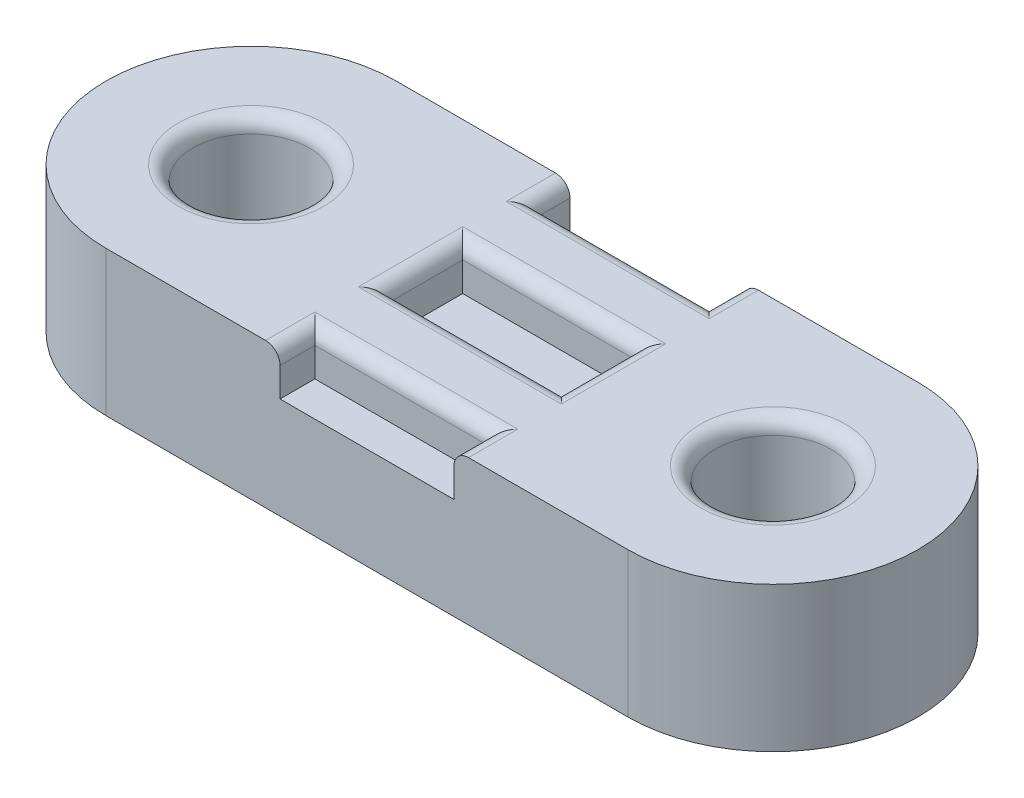
ISO-10303-21;
HEADER;
FILE_DESCRIPTION(('STEP AP214'),'2;1');
FILE_NAME('part.step','',(''),(''),'','','');
FILE_SCHEMA(('AUTOMOTIVE_DESIGN { 1 0 10303 214 1 1 1 1 }'));
ENDSEC;
DATA;
#1=APPLICATION_CONTEXT('core data for automotive mechanical design processes');
#2=APPLICATION_PROTOCOL_DEFINITION('international standard','automotive_design',2000,#1);
#3=PRODUCT_CONTEXT('',#1,'mechanical');
#4=PRODUCT('Part','Part','',(#3));
#5=PRODUCT_RELATED_PRODUCT_CATEGORY('part','',(#4));
#6=PRODUCT_DEFINITION_FORMATION('','',#4);
#7=PRODUCT_DEFINITION_CONTEXT('part definition',#1,'design');
#8=PRODUCT_DEFINITION('design','',#6,#7);
#9=PRODUCT_DEFINITION_SHAPE('','',#8);
#10=(LENGTH_UNIT() NAMED_UNIT(*) SI_UNIT(.MILLI.,.METRE.));
#11=(NAMED_UNIT(*) PLANE_ANGLE_UNIT() SI_UNIT($,.RADIAN.));
#12=(NAMED_UNIT(*) SI_UNIT($,.STERADIAN.) SOLID_ANGLE_UNIT());
#13=UNCERTAINTY_MEASURE_WITH_UNIT(LENGTH_MEASURE(1.E-05),#10,'distance_accuracy_value','');
#14=(GEOMETRIC_REPRESENTATION_CONTEXT(3) GLOBAL_UNCERTAINTY_ASSIGNED_CONTEXT((#13)) GLOBAL_UNIT_ASSIGNED_CONTEXT((#10,
#11,#12)) REPRESENTATION_CONTEXT('',''));
#15=CARTESIAN_POINT('',(0.,0.,0.));
#16=DIRECTION('',(0.,0.,1.));
#17=DIRECTION('',(1.,0.,0.));
#18=AXIS2_PLACEMENT_3D('',#15,#16,#17);
#19=CARTESIAN_POINT('',(-18.,5.,-5.));
#20=DIRECTION('',(0.,-1.,0.));
#21=DIRECTION('',(0.,0.,-1.));
#22=AXIS2_PLACEMENT_3D('',#19,#20,#21);
#23=CYLINDRICAL_SURFACE('',#22,5.);
#24=CARTESIAN_POINT('',(-18.,0.,-5.));
#25=DIRECTION('',(0.,1.,0.));
#26=DIRECTION('',(0.,0.,1.));
#27=AXIS2_PLACEMENT_3D('',#24,#25,#26);
#28=CIRCLE('',#27,5.);
#29=CARTESIAN_POINT('',(-18.,0.,-10.));
#30=VERTEX_POINT('',#29);
#31=CARTESIAN_POINT('',(-18.,0.,0.));
#32=VERTEX_POINT('',#31);
#33=EDGE_CURVE('E258',#30,#32,#28,.T.);
#34=ORIENTED_EDGE('',*,*,#33,.T.);
#35=DIRECTION('',(0.,-1.,0.));
#36=VECTOR('',#35,1.);
#37=CARTESIAN_POINT('',(-18.,5.,0.));
#38=LINE('',#37,#36);
#39=CARTESIAN_POINT('',(-18.,5.,0.));
#40=VERTEX_POINT('',#39);
#41=EDGE_CURVE('E297',#40,#32,#38,.T.);
#42=ORIENTED_EDGE('',*,*,#41,.F.);
#43=CARTESIAN_POINT('',(-18.,5.,-5.));
#44=DIRECTION('',(0.,1.,0.));
#45=DIRECTION('',(0.,0.,1.));
#46=AXIS2_PLACEMENT_3D('',#43,#44,#45);
#47=CIRCLE('',#46,5.);
#48=CARTESIAN_POINT('',(-18.,5.,-10.));
#49=VERTEX_POINT('',#48);
#50=EDGE_CURVE('E267',#49,#40,#47,.T.);
#51=ORIENTED_EDGE('',*,*,#50,.F.);
#52=DIRECTION('',(0.,-1.,0.));
#53=VECTOR('',#52,1.);
#54=CARTESIAN_POINT('',(-18.,5.,-10.));
#55=LINE('',#54,#53);
#56=EDGE_CURVE('E281',#49,#30,#55,.T.);
#57=ORIENTED_EDGE('',*,*,#56,.T.);
#58=EDGE_LOOP('',(#34,#42,#51,#57));
#59=FACE_BOUND('',#58,.T.);
#60=ADVANCED_FACE('F33',(#59),#23,.T.);
#61=CARTESIAN_POINT('',(-18.,5.,0.));
#62=DIRECTION('',(0.,0.,-1.));
#63=DIRECTION('',(-1.,0.,0.));
#64=AXIS2_PLACEMENT_3D('',#61,#62,#63);
#65=PLANE('',#64);
#66=DIRECTION('',(1.,0.,0.));
#67=VECTOR('',#66,1.);
#68=CARTESIAN_POINT('',(-18.,5.,0.));
#69=LINE('',#68,#67);
#70=CARTESIAN_POINT('',(-5.49999999999999,5.,0.));
#71=VERTEX_POINT('',#70);
#72=CARTESIAN_POINT('',(0.,5.,0.));
#73=VERTEX_POINT('',#72);
#74=EDGE_CURVE('E270',#71,#73,#69,.T.);
#75=ORIENTED_EDGE('',*,*,#74,.F.);
#76=CARTESIAN_POINT('',(-5.49999999999999,4.5,0.));
#77=DIRECTION('',(0.,0.,-1.));
#78=DIRECTION('',(-1.,0.,0.));
#79=AXIS2_PLACEMENT_3D('',#76,#77,#78);
#80=CIRCLE('',#79,0.5);
#81=CARTESIAN_POINT('',(-5.99999999999999,4.5,0.));
#82=VERTEX_POINT('',#81);
#83=EDGE_CURVE('E350',#71,#82,#80,.F.);
#84=ORIENTED_EDGE('',*,*,#83,.T.);
#85=DIRECTION('',(0.,1.,0.));
#86=VECTOR('',#85,1.);
#87=CARTESIAN_POINT('',(-5.99999999999999,3.5,0.));
#88=LINE('',#87,#86);
#89=CARTESIAN_POINT('',(-5.99999999999999,3.5,0.));
#90=VERTEX_POINT('',#89);
#91=EDGE_CURVE('E262',#90,#82,#88,.T.);
#92=ORIENTED_EDGE('',*,*,#91,.F.);
#93=DIRECTION('',(1.,0.,0.));
#94=VECTOR('',#93,1.);
#95=CARTESIAN_POINT('',(-5.99999999999999,3.5,0.));
#96=LINE('',#95,#94);
#97=CARTESIAN_POINT('',(-12.,3.5,0.));
#98=VERTEX_POINT('',#97);
#99=EDGE_CURVE('E245',#98,#90,#96,.T.);
#100=ORIENTED_EDGE('',*,*,#99,.F.);
#101=DIRECTION('',(0.,1.,0.));
#102=VECTOR('',#101,1.);
#103=CARTESIAN_POINT('',(-12.,3.5,0.));
#104=LINE('',#103,#102);
#105=CARTESIAN_POINT('',(-12.,4.5,0.));
#106=VERTEX_POINT('',#105);
#107=EDGE_CURVE('E254',#98,#106,#104,.T.);
#108=ORIENTED_EDGE('',*,*,#107,.T.);
#109=CARTESIAN_POINT('',(-12.5,4.5,0.));
#110=DIRECTION('',(0.,0.,-1.));
#111=DIRECTION('',(-1.,0.,0.));
#112=AXIS2_PLACEMENT_3D('',#109,#110,#111);
#113=CIRCLE('',#112,0.5);
#114=CARTESIAN_POINT('',(-12.5,5.,0.));
#115=VERTEX_POINT('',#114);
#116=EDGE_CURVE('E348',#106,#115,#113,.F.);
#117=ORIENTED_EDGE('',*,*,#116,.T.);
#118=EDGE_CURVE('E272',#40,#115,#69,.T.);
#119=ORIENTED_EDGE('',*,*,#118,.F.);
#120=ORIENTED_EDGE('',*,*,#41,.T.);
#121=DIRECTION('',(1.,0.,0.));
#122=VECTOR('',#121,1.);
#123=CARTESIAN_POINT('',(-18.,0.,0.));
#124=LINE('',#123,#122);
#125=CARTESIAN_POINT('',(0.,0.,0.));
#126=VERTEX_POINT('',#125);
#127=EDGE_CURVE('E284',#32,#126,#124,.T.);
#128=ORIENTED_EDGE('',*,*,#127,.T.);
#129=DIRECTION('',(0.,-1.,0.));
#130=VECTOR('',#129,1.);
#131=CARTESIAN_POINT('',(0.,5.,0.));
#132=LINE('',#131,#130);
#133=EDGE_CURVE('E294',#73,#126,#132,.T.);
#134=ORIENTED_EDGE('',*,*,#133,.F.);
#135=EDGE_LOOP('',(#75,#84,#92,#100,#108,#117,#119,#120,#128,#134));
#136=FACE_BOUND('',#135,.T.);
#137=ADVANCED_FACE('F439',(#136),#65,.F.);
#138=CARTESIAN_POINT('',(0.,5.,-5.));
#139=DIRECTION('',(0.,-1.,0.));
#140=DIRECTION('',(0.,0.,-1.));
#141=AXIS2_PLACEMENT_3D('',#138,#139,#140);
#142=CYLINDRICAL_SURFACE('',#141,5.);
#143=CARTESIAN_POINT('',(0.,0.,-5.));
#144=DIRECTION('',(0.,1.,0.));
#145=DIRECTION('',(0.,0.,1.));
#146=AXIS2_PLACEMENT_3D('',#143,#144,#145);
#147=CIRCLE('',#146,5.);
#148=CARTESIAN_POINT('',(0.,0.,-10.));
#149=VERTEX_POINT('',#148);
#150=EDGE_CURVE('E286',#126,#149,#147,.T.);
#151=ORIENTED_EDGE('',*,*,#150,.T.);
#152=DIRECTION('',(0.,-1.,0.));
#153=VECTOR('',#152,1.);
#154=CARTESIAN_POINT('',(0.,5.,-10.));
#155=LINE('',#154,#153);
#156=CARTESIAN_POINT('',(0.,5.,-10.));
#157=VERTEX_POINT('',#156);
#158=EDGE_CURVE('E291',#157,#149,#155,.T.);
#159=ORIENTED_EDGE('',*,*,#158,.F.);
#160=CARTESIAN_POINT('',(0.,5.,-5.));
#161=DIRECTION('',(0.,1.,0.));
#162=DIRECTION('',(0.,0.,1.));
#163=AXIS2_PLACEMENT_3D('',#160,#161,#162);
#164=CIRCLE('',#163,5.);
#165=EDGE_CURVE('E275',#73,#157,#164,.T.);
#166=ORIENTED_EDGE('',*,*,#165,.F.);
#167=ORIENTED_EDGE('',*,*,#133,.T.);
#168=EDGE_LOOP('',(#151,#159,#166,#167));
#169=FACE_BOUND('',#168,.T.);
#170=ADVANCED_FACE('F407',(#169),#142,.T.);
#171=CARTESIAN_POINT('',(-18.,5.,-10.));
#172=DIRECTION('',(0.,0.,1.));
#173=DIRECTION('',(1.,0.,0.));
#174=AXIS2_PLACEMENT_3D('',#171,#172,#173);
#175=PLANE('',#174);
#176=DIRECTION('',(-1.,0.,0.));
#177=VECTOR('',#176,1.);
#178=CARTESIAN_POINT('',(-18.,5.,-10.));
#179=LINE('',#178,#177);
#180=CARTESIAN_POINT('',(-12.5,5.,-10.));
#181=VERTEX_POINT('',#180);
#182=EDGE_CURVE('E277',#181,#49,#179,.T.);
#183=ORIENTED_EDGE('',*,*,#182,.F.);
#184=CARTESIAN_POINT('',(-12.5,4.5,-10.));
#185=DIRECTION('',(0.,0.,1.));
#186=DIRECTION('',(1.,0.,0.));
#187=AXIS2_PLACEMENT_3D('',#184,#185,#186);
#188=CIRCLE('',#187,0.5);
#189=CARTESIAN_POINT('',(-12.,4.5,-10.));
#190=VERTEX_POINT('',#189);
#191=EDGE_CURVE('E368',#181,#190,#188,.F.);
#192=ORIENTED_EDGE('',*,*,#191,.T.);
#193=DIRECTION('',(0.,1.,0.));
#194=VECTOR('',#193,1.);
#195=CARTESIAN_POINT('',(-12.,3.5,-10.));
#196=LINE('',#195,#194);
#197=CARTESIAN_POINT('',(-12.,3.5,-10.));
#198=VERTEX_POINT('',#197);
#199=EDGE_CURVE('E234',#198,#190,#196,.T.);
#200=ORIENTED_EDGE('',*,*,#199,.F.);
#201=DIRECTION('',(-1.,0.,0.));
#202=VECTOR('',#201,1.);
#203=CARTESIAN_POINT('',(-5.99999999999999,3.5,-10.));
#204=LINE('',#203,#202);
#205=CARTESIAN_POINT('',(-5.99999999999999,3.5,-10.));
#206=VERTEX_POINT('',#205);
#207=EDGE_CURVE('E230',#206,#198,#204,.T.);
#208=ORIENTED_EDGE('',*,*,#207,.F.);
#209=DIRECTION('',(0.,1.,0.));
#210=VECTOR('',#209,1.);
#211=CARTESIAN_POINT('',(-5.99999999999999,3.5,-10.));
#212=LINE('',#211,#210);
#213=CARTESIAN_POINT('',(-5.99999999999999,4.5,-10.));
#214=VERTEX_POINT('',#213);
#215=EDGE_CURVE('E238',#206,#214,#212,.T.);
#216=ORIENTED_EDGE('',*,*,#215,.T.);
#217=CARTESIAN_POINT('',(-5.49999999999999,4.5,-10.));
#218=DIRECTION('',(0.,0.,1.));
#219=DIRECTION('',(1.,0.,0.));
#220=AXIS2_PLACEMENT_3D('',#217,#218,#219);
#221=CIRCLE('',#220,0.5);
#222=CARTESIAN_POINT('',(-5.49999999999999,5.,-10.));
#223=VERTEX_POINT('',#222);
#224=EDGE_CURVE('E366',#214,#223,#221,.F.);
#225=ORIENTED_EDGE('',*,*,#224,.T.);
#226=EDGE_CURVE('E278',#157,#223,#179,.T.);
#227=ORIENTED_EDGE('',*,*,#226,.F.);
#228=ORIENTED_EDGE('',*,*,#158,.T.);
#229=DIRECTION('',(-1.,0.,0.));
#230=VECTOR('',#229,1.);
#231=CARTESIAN_POINT('',(-18.,0.,-10.));
#232=LINE('',#231,#230);
#233=EDGE_CURVE('E271',#149,#30,#232,.T.);
#234=ORIENTED_EDGE('',*,*,#233,.T.);
#235=ORIENTED_EDGE('',*,*,#56,.F.);
#236=EDGE_LOOP('',(#183,#192,#200,#208,#216,#225,#227,#228,#234,#235));
#237=FACE_BOUND('',#236,.T.);
#238=ADVANCED_FACE('F397',(#237),#175,.F.);
#239=CARTESIAN_POINT('',(-18.,5.,-5.));
#240=DIRECTION('',(0.,1.,0.));
#241=DIRECTION('',(0.,0.,1.));
#242=AXIS2_PLACEMENT_3D('',#239,#240,#241);
#243=PLANE('',#242);
#244=DIRECTION('',(1.,0.,0.));
#245=VECTOR('',#244,1.);
#246=CARTESIAN_POINT('',(-12.,5.,-3.2));
#247=LINE('',#246,#245);
#248=CARTESIAN_POINT('',(-5.5,5.,-3.20000000000001));
#249=VERTEX_POINT('',#248);
#250=CARTESIAN_POINT('',(-12.5,5.,-3.2));
#251=VERTEX_POINT('',#250);
#252=EDGE_CURVE('E337',#249,#251,#247,.F.);
#253=ORIENTED_EDGE('',*,*,#252,.T.);
#254=DIRECTION('',(0.,0.,1.));
#255=VECTOR('',#254,1.);
#256=CARTESIAN_POINT('',(-12.5,5.,-6.3));
#257=LINE('',#256,#255);
#258=CARTESIAN_POINT('',(-12.5,5.,-6.80000000000001));
#259=VERTEX_POINT('',#258);
#260=EDGE_CURVE('E339',#251,#259,#257,.F.);
#261=ORIENTED_EDGE('',*,*,#260,.T.);
#262=DIRECTION('',(-1.,0.,0.));
#263=VECTOR('',#262,1.);
#264=CARTESIAN_POINT('',(-6.,5.,-6.80000000000001));
#265=LINE('',#264,#263);
#266=CARTESIAN_POINT('',(-5.5,5.,-6.80000000000001));
#267=VERTEX_POINT('',#266);
#268=EDGE_CURVE('E333',#259,#267,#265,.F.);
#269=ORIENTED_EDGE('',*,*,#268,.T.);
#270=DIRECTION('',(0.,0.,-1.));
#271=VECTOR('',#270,1.);
#272=CARTESIAN_POINT('',(-5.5,5.,-3.70000000000001));
#273=LINE('',#272,#271);
#274=EDGE_CURVE('E335',#267,#249,#273,.F.);
#275=ORIENTED_EDGE('',*,*,#274,.T.);
#276=EDGE_LOOP('',(#253,#261,#269,#275));
#277=FACE_BOUND('',#276,.T.);
#278=DIRECTION('',(-1.,0.,0.));
#279=VECTOR('',#278,1.);
#280=CARTESIAN_POINT('',(-5.99999999999999,5.,-1.7));
#281=LINE('',#280,#279);
#282=CARTESIAN_POINT('',(-12.5,5.,-1.7));
#283=VERTEX_POINT('',#282);
#284=CARTESIAN_POINT('',(-5.49999999999999,5.,-1.7));
#285=VERTEX_POINT('',#284);
#286=EDGE_CURVE('E344',#283,#285,#281,.F.);
#287=ORIENTED_EDGE('',*,*,#286,.T.);
#288=DIRECTION('',(0.,0.,-1.));
#289=VECTOR('',#288,1.);
#290=CARTESIAN_POINT('',(-5.49999999999999,5.,0.));
#291=LINE('',#290,#289);
#292=EDGE_CURVE('E346',#285,#71,#291,.F.);
#293=ORIENTED_EDGE('',*,*,#292,.T.);
#294=ORIENTED_EDGE('',*,*,#74,.T.);
#295=ORIENTED_EDGE('',*,*,#165,.T.);
#296=ORIENTED_EDGE('',*,*,#226,.T.);
#297=DIRECTION('',(0.,0.,-1.));
#298=VECTOR('',#297,1.);
#299=CARTESIAN_POINT('',(-5.49999999999999,5.,-8.80000000000001));
#300=LINE('',#299,#298);
#301=CARTESIAN_POINT('',(-5.49999999999999,5.,-8.30000000000001));
#302=VERTEX_POINT('',#301);
#303=EDGE_CURVE('E329',#223,#302,#300,.F.);
#304=ORIENTED_EDGE('',*,*,#303,.T.);
#305=DIRECTION('',(1.,0.,0.));
#306=VECTOR('',#305,1.);
#307=CARTESIAN_POINT('',(-12.,5.,-8.30000000000001));
#308=LINE('',#307,#306);
#309=CARTESIAN_POINT('',(-12.5,5.,-8.30000000000001));
#310=VERTEX_POINT('',#309);
#311=EDGE_CURVE('E327',#302,#310,#308,.F.);
#312=ORIENTED_EDGE('',*,*,#311,.T.);
#313=DIRECTION('',(0.,0.,1.));
#314=VECTOR('',#313,1.);
#315=CARTESIAN_POINT('',(-12.5,5.,-10.));
#316=LINE('',#315,#314);
#317=EDGE_CURVE('E331',#310,#181,#316,.F.);
#318=ORIENTED_EDGE('',*,*,#317,.T.);
#319=ORIENTED_EDGE('',*,*,#182,.T.);
#320=ORIENTED_EDGE('',*,*,#50,.T.);
#321=ORIENTED_EDGE('',*,*,#118,.T.);
#322=DIRECTION('',(0.,0.,1.));
#323=VECTOR('',#322,1.);
#324=CARTESIAN_POINT('',(-12.5,5.,-1.2));
#325=LINE('',#324,#323);
#326=EDGE_CURVE('E342',#115,#283,#325,.F.);
#327=ORIENTED_EDGE('',*,*,#326,.T.);
#328=EDGE_LOOP('',(#287,#293,#294,#295,#296,#304,#312,#318,#319,#320,#321,#327));
#329=FACE_BOUND('',#328,.T.);
#330=CARTESIAN_POINT('',(0.,5.,-5.));
#331=DIRECTION('',(0.,1.,0.));
#332=DIRECTION('',(0.,0.,1.));
#333=AXIS2_PLACEMENT_3D('',#330,#331,#332);
#334=CIRCLE('',#333,2.5);
#335=CARTESIAN_POINT('',(0.,5.,-2.5));
#336=VERTEX_POINT('',#335);
#337=EDGE_CURVE('E303',#336,#336,#334,.F.);
#338=ORIENTED_EDGE('',*,*,#337,.T.);
#339=EDGE_LOOP('',(#338));
#340=FACE_BOUND('',#339,.T.);
#341=CARTESIAN_POINT('',(-18.,5.,-5.));
#342=DIRECTION('',(0.,1.,0.));
#343=DIRECTION('',(0.,0.,1.));
#344=AXIS2_PLACEMENT_3D('',#341,#342,#343);
#345=CIRCLE('',#344,2.5);
#346=CARTESIAN_POINT('',(-18.,5.,-2.5));
#347=VERTEX_POINT('',#346);
#348=EDGE_CURVE('E300',#347,#347,#345,.F.);
#349=ORIENTED_EDGE('',*,*,#348,.T.);
#350=EDGE_LOOP('',(#349));
#351=FACE_BOUND('',#350,.T.);
#352=ADVANCED_FACE('F400',(#277,#329,#340,#351),#243,.T.);
#353=CARTESIAN_POINT('',(-18.,0.,-5.));
#354=DIRECTION('',(0.,1.,0.));
#355=DIRECTION('',(0.,0.,1.));
#356=AXIS2_PLACEMENT_3D('',#353,#354,#355);
#357=PLANE('',#356);
#358=CARTESIAN_POINT('',(0.,0.,-5.));
#359=DIRECTION('',(0.,1.,0.));
#360=DIRECTION('',(0.,0.,1.));
#361=AXIS2_PLACEMENT_3D('',#358,#359,#360);
#362=CIRCLE('',#361,2.5);
#363=CARTESIAN_POINT('',(0.,0.,-2.5));
#364=VERTEX_POINT('',#363);
#365=EDGE_CURVE('E321',#364,#364,#362,.T.);
#366=ORIENTED_EDGE('',*,*,#365,.T.);
#367=EDGE_LOOP('',(#366));
#368=FACE_BOUND('',#367,.T.);
#369=CARTESIAN_POINT('',(-18.,0.,-5.));
#370=DIRECTION('',(0.,1.,0.));
#371=DIRECTION('',(0.,0.,1.));
#372=AXIS2_PLACEMENT_3D('',#369,#370,#371);
#373=CIRCLE('',#372,2.5);
#374=CARTESIAN_POINT('',(-18.,0.,-2.5));
#375=VERTEX_POINT('',#374);
#376=EDGE_CURVE('E318',#375,#375,#373,.T.);
#377=ORIENTED_EDGE('',*,*,#376,.T.);
#378=EDGE_LOOP('',(#377));
#379=FACE_BOUND('',#378,.T.);
#380=ORIENTED_EDGE('',*,*,#33,.F.);
#381=ORIENTED_EDGE('',*,*,#233,.F.);
#382=ORIENTED_EDGE('',*,*,#150,.F.);
#383=ORIENTED_EDGE('',*,*,#127,.F.);
#384=EDGE_LOOP('',(#380,#381,#382,#383));
#385=FACE_BOUND('',#384,.T.);
#386=ADVANCED_FACE('F413',(#368,#379,#385),#357,.F.);
#387=CARTESIAN_POINT('',(-18.,10.6568542494924,-5.));
#388=DIRECTION('',(0.,-1.,0.));
#389=DIRECTION('',(0.,0.,-1.));
#390=AXIS2_PLACEMENT_3D('',#387,#388,#389);
#391=CYLINDRICAL_SURFACE('',#390,2.);
#392=CARTESIAN_POINT('',(-18.,4.5,-5.));
#393=DIRECTION('',(0.,1.,0.));
#394=DIRECTION('',(0.,0.,1.));
#395=AXIS2_PLACEMENT_3D('',#392,#393,#394);
#396=CIRCLE('',#395,2.);
#397=CARTESIAN_POINT('',(-18.,4.5,-3.));
#398=VERTEX_POINT('',#397);
#399=EDGE_CURVE('E315',#398,#398,#396,.T.);
#400=ORIENTED_EDGE('',*,*,#399,.T.);
#401=EDGE_LOOP('',(#400));
#402=FACE_BOUND('',#401,.T.);
#403=CARTESIAN_POINT('',(-18.,0.5,-5.));
#404=DIRECTION('',(0.,1.,0.));
#405=DIRECTION('',(0.,0.,1.));
#406=AXIS2_PLACEMENT_3D('',#403,#404,#405);
#407=CIRCLE('',#406,2.);
#408=CARTESIAN_POINT('',(-18.,0.5,-3.));
#409=VERTEX_POINT('',#408);
#410=EDGE_CURVE('E312',#409,#409,#407,.F.);
#411=ORIENTED_EDGE('',*,*,#410,.T.);
#412=EDGE_LOOP('',(#411));
#413=FACE_BOUND('',#412,.T.);
#414=ADVANCED_FACE('F656',(#402,#413),#391,.F.);
#415=CARTESIAN_POINT('',(0.,10.6568542494924,-5.));
#416=DIRECTION('',(0.,-1.,0.));
#417=DIRECTION('',(0.,0.,-1.));
#418=AXIS2_PLACEMENT_3D('',#415,#416,#417);
#419=CYLINDRICAL_SURFACE('',#418,2.);
#420=CARTESIAN_POINT('',(0.,4.5,-5.));
#421=DIRECTION('',(0.,1.,0.));
#422=DIRECTION('',(0.,0.,1.));
#423=AXIS2_PLACEMENT_3D('',#420,#421,#422);
#424=CIRCLE('',#423,2.);
#425=CARTESIAN_POINT('',(0.,4.5,-3.));
#426=VERTEX_POINT('',#425);
#427=EDGE_CURVE('E309',#426,#426,#424,.T.);
#428=ORIENTED_EDGE('',*,*,#427,.T.);
#429=EDGE_LOOP('',(#428));
#430=FACE_BOUND('',#429,.T.);
#431=CARTESIAN_POINT('',(0.,0.5,-5.));
#432=DIRECTION('',(0.,1.,0.));
#433=DIRECTION('',(0.,0.,1.));
#434=AXIS2_PLACEMENT_3D('',#431,#432,#433);
#435=CIRCLE('',#434,2.);
#436=CARTESIAN_POINT('',(0.,0.5,-3.));
#437=VERTEX_POINT('',#436);
#438=EDGE_CURVE('E306',#437,#437,#435,.F.);
#439=ORIENTED_EDGE('',*,*,#438,.T.);
#440=EDGE_LOOP('',(#439));
#441=FACE_BOUND('',#440,.T.);
#442=ADVANCED_FACE('F452',(#430,#441),#419,.F.);
#443=CARTESIAN_POINT('',(0.,4.5,-5.));
#444=DIRECTION('',(0.,1.,0.));
#445=DIRECTION('',(0.,0.,1.));
#446=AXIS2_PLACEMENT_3D('',#443,#444,#445);
#447=TOROIDAL_SURFACE('',#446,2.5,0.5);
#448=ORIENTED_EDGE('',*,*,#427,.F.);
#449=EDGE_LOOP('',(#448));
#450=FACE_BOUND('',#449,.T.);
#451=ORIENTED_EDGE('',*,*,#337,.F.);
#452=EDGE_LOOP('',(#451));
#453=FACE_BOUND('',#452,.T.);
#454=ADVANCED_FACE('F448',(#450,#453),#447,.T.);
#455=CARTESIAN_POINT('',(-18.,4.5,-5.));
#456=DIRECTION('',(0.,1.,0.));
#457=DIRECTION('',(0.,0.,1.));
#458=AXIS2_PLACEMENT_3D('',#455,#456,#457);
#459=TOROIDAL_SURFACE('',#458,2.5,0.5);
#460=ORIENTED_EDGE('',*,*,#399,.F.);
#461=EDGE_LOOP('',(#460));
#462=FACE_BOUND('',#461,.T.);
#463=ORIENTED_EDGE('',*,*,#348,.F.);
#464=EDGE_LOOP('',(#463));
#465=FACE_BOUND('',#464,.T.);
#466=ADVANCED_FACE('F451',(#462,#465),#459,.T.);
#467=CARTESIAN_POINT('',(0.,0.5,-5.));
#468=DIRECTION('',(0.,1.,0.));
#469=DIRECTION('',(0.,0.,1.));
#470=AXIS2_PLACEMENT_3D('',#467,#468,#469);
#471=TOROIDAL_SURFACE('',#470,2.5,0.5);
#472=ORIENTED_EDGE('',*,*,#365,.F.);
#473=EDGE_LOOP('',(#472));
#474=FACE_BOUND('',#473,.T.);
#475=ORIENTED_EDGE('',*,*,#438,.F.);
#476=EDGE_LOOP('',(#475));
#477=FACE_BOUND('',#476,.T.);
#478=ADVANCED_FACE('F456',(#474,#477),#471,.T.);
#479=CARTESIAN_POINT('',(-18.,0.5,-5.));
#480=DIRECTION('',(0.,1.,0.));
#481=DIRECTION('',(0.,0.,1.));
#482=AXIS2_PLACEMENT_3D('',#479,#480,#481);
#483=TOROIDAL_SURFACE('',#482,2.5,0.5);
#484=ORIENTED_EDGE('',*,*,#376,.F.);
#485=EDGE_LOOP('',(#484));
#486=FACE_BOUND('',#485,.T.);
#487=ORIENTED_EDGE('',*,*,#410,.F.);
#488=EDGE_LOOP('',(#487));
#489=FACE_BOUND('',#488,.T.);
#490=ADVANCED_FACE('F460',(#486,#489),#483,.T.);
#491=CARTESIAN_POINT('',(-12.,3.5,0.));
#492=DIRECTION('',(-1.,0.,0.));
#493=DIRECTION('',(0.,0.,1.));
#494=AXIS2_PLACEMENT_3D('',#491,#492,#493);
#495=PLANE('',#494);
#496=DIRECTION('',(0.,1.,0.));
#497=VECTOR('',#496,1.);
#498=CARTESIAN_POINT('',(-12.,3.5,-1.2));
#499=LINE('',#498,#497);
#500=CARTESIAN_POINT('',(-12.,3.5,-1.2));
#501=VERTEX_POINT('',#500);
#502=CARTESIAN_POINT('',(-12.,4.5,-1.2));
#503=VERTEX_POINT('',#502);
#504=EDGE_CURVE('E255',#501,#503,#499,.T.);
#505=ORIENTED_EDGE('',*,*,#504,.T.);
#506=DIRECTION('',(0.,0.,1.));
#507=VECTOR('',#506,1.);
#508=CARTESIAN_POINT('',(-12.,4.5,0.));
#509=LINE('',#508,#507);
#510=EDGE_CURVE('E354',#503,#106,#509,.T.);
#511=ORIENTED_EDGE('',*,*,#510,.T.);
#512=ORIENTED_EDGE('',*,*,#107,.F.);
#513=DIRECTION('',(0.,0.,1.));
#514=VECTOR('',#513,1.);
#515=CARTESIAN_POINT('',(-12.,3.5,0.));
#516=LINE('',#515,#514);
#517=EDGE_CURVE('E237',#501,#98,#516,.T.);
#518=ORIENTED_EDGE('',*,*,#517,.F.);
#519=EDGE_LOOP('',(#505,#511,#512,#518));
#520=FACE_BOUND('',#519,.T.);
#521=ADVANCED_FACE('F464',(#520),#495,.F.);
#522=CARTESIAN_POINT('',(-5.99999999999999,3.5,-1.2));
#523=DIRECTION('',(0.,0.,-1.));
#524=DIRECTION('',(-1.,0.,0.));
#525=AXIS2_PLACEMENT_3D('',#522,#523,#524);
#526=PLANE('',#525);
#527=DIRECTION('',(0.,1.,0.));
#528=VECTOR('',#527,1.);
#529=CARTESIAN_POINT('',(-5.99999999999999,3.5,-1.2));
#530=LINE('',#529,#528);
#531=CARTESIAN_POINT('',(-5.99999999999999,3.5,-1.2));
#532=VERTEX_POINT('',#531);
#533=CARTESIAN_POINT('',(-5.99999999999999,4.5,-1.2));
#534=VERTEX_POINT('',#533);
#535=EDGE_CURVE('E259',#532,#534,#530,.T.);
#536=ORIENTED_EDGE('',*,*,#535,.T.);
#537=DIRECTION('',(-1.,0.,0.));
#538=VECTOR('',#537,1.);
#539=CARTESIAN_POINT('',(-12.,4.5,-1.2));
#540=LINE('',#539,#538);
#541=EDGE_CURVE('E352',#534,#503,#540,.T.);
#542=ORIENTED_EDGE('',*,*,#541,.T.);
#543=ORIENTED_EDGE('',*,*,#504,.F.);
#544=DIRECTION('',(-1.,0.,0.));
#545=VECTOR('',#544,1.);
#546=CARTESIAN_POINT('',(-5.99999999999999,3.5,-1.2));
#547=LINE('',#546,#545);
#548=EDGE_CURVE('E251',#532,#501,#547,.T.);
#549=ORIENTED_EDGE('',*,*,#548,.F.);
#550=EDGE_LOOP('',(#536,#542,#543,#549));
#551=FACE_BOUND('',#550,.T.);
#552=ADVANCED_FACE('F596',(#551),#526,.F.);
#553=CARTESIAN_POINT('',(-5.99999999999999,3.5,0.));
#554=DIRECTION('',(1.,0.,0.));
#555=DIRECTION('',(0.,0.,-1.));
#556=AXIS2_PLACEMENT_3D('',#553,#554,#555);
#557=PLANE('',#556);
#558=ORIENTED_EDGE('',*,*,#91,.T.);
#559=DIRECTION('',(0.,0.,-1.));
#560=VECTOR('',#559,1.);
#561=CARTESIAN_POINT('',(-5.99999999999999,4.5,-1.2));
#562=LINE('',#561,#560);
#563=EDGE_CURVE('E324',#82,#534,#562,.T.);
#564=ORIENTED_EDGE('',*,*,#563,.T.);
#565=ORIENTED_EDGE('',*,*,#535,.F.);
#566=DIRECTION('',(0.,0.,-1.));
#567=VECTOR('',#566,1.);
#568=CARTESIAN_POINT('',(-5.99999999999999,3.5,0.));
#569=LINE('',#568,#567);
#570=EDGE_CURVE('E248',#90,#532,#569,.T.);
#571=ORIENTED_EDGE('',*,*,#570,.F.);
#572=EDGE_LOOP('',(#558,#564,#565,#571));
#573=FACE_BOUND('',#572,.T.);
#574=ADVANCED_FACE('F591',(#573),#557,.F.);
#575=CARTESIAN_POINT('',(0.,3.5,0.));
#576=DIRECTION('',(0.,1.,0.));
#577=DIRECTION('',(0.,0.,1.));
#578=AXIS2_PLACEMENT_3D('',#575,#576,#577);
#579=PLANE('',#578);
#580=ORIENTED_EDGE('',*,*,#517,.T.);
#581=ORIENTED_EDGE('',*,*,#99,.T.);
#582=ORIENTED_EDGE('',*,*,#570,.T.);
#583=ORIENTED_EDGE('',*,*,#548,.T.);
#584=EDGE_LOOP('',(#580,#581,#582,#583));
#585=FACE_BOUND('',#584,.T.);
#586=ADVANCED_FACE('F435',(#585),#579,.T.);
#587=CARTESIAN_POINT('',(-12.,3.5,-8.80000000000001));
#588=DIRECTION('',(-1.,0.,0.));
#589=DIRECTION('',(0.,0.,1.));
#590=AXIS2_PLACEMENT_3D('',#587,#588,#589);
#591=PLANE('',#590);
#592=ORIENTED_EDGE('',*,*,#199,.T.);
#593=DIRECTION('',(0.,0.,1.));
#594=VECTOR('',#593,1.);
#595=CARTESIAN_POINT('',(-12.,4.5,-8.80000000000001));
#596=LINE('',#595,#594);
#597=CARTESIAN_POINT('',(-12.,4.5,-8.80000000000001));
#598=VERTEX_POINT('',#597);
#599=EDGE_CURVE('E363',#190,#598,#596,.T.);
#600=ORIENTED_EDGE('',*,*,#599,.T.);
#601=DIRECTION('',(0.,1.,0.));
#602=VECTOR('',#601,1.);
#603=CARTESIAN_POINT('',(-12.,3.5,-8.80000000000001));
#604=LINE('',#603,#602);
#605=CARTESIAN_POINT('',(-12.,3.5,-8.80000000000001));
#606=VERTEX_POINT('',#605);
#607=EDGE_CURVE('E233',#606,#598,#604,.T.);
#608=ORIENTED_EDGE('',*,*,#607,.F.);
#609=DIRECTION('',(0.,0.,1.));
#610=VECTOR('',#609,1.);
#611=CARTESIAN_POINT('',(-12.,3.5,-8.80000000000001));
#612=LINE('',#611,#610);
#613=EDGE_CURVE('E217',#198,#606,#612,.T.);
#614=ORIENTED_EDGE('',*,*,#613,.F.);
#615=EDGE_LOOP('',(#592,#600,#608,#614));
#616=FACE_BOUND('',#615,.T.);
#617=ADVANCED_FACE('F421',(#616),#591,.F.);
#618=CARTESIAN_POINT('',(-5.99999999999999,3.5,-8.80000000000001));
#619=DIRECTION('',(1.,0.,0.));
#620=DIRECTION('',(0.,0.,-1.));
#621=AXIS2_PLACEMENT_3D('',#618,#619,#620);
#622=PLANE('',#621);
#623=DIRECTION('',(0.,1.,0.));
#624=VECTOR('',#623,1.);
#625=CARTESIAN_POINT('',(-5.99999999999999,3.5,-8.80000000000001));
#626=LINE('',#625,#624);
#627=CARTESIAN_POINT('',(-5.99999999999999,3.5,-8.80000000000001));
#628=VERTEX_POINT('',#627);
#629=CARTESIAN_POINT('',(-5.99999999999999,4.5,-8.80000000000001));
#630=VERTEX_POINT('',#629);
#631=EDGE_CURVE('E240',#628,#630,#626,.T.);
#632=ORIENTED_EDGE('',*,*,#631,.T.);
#633=DIRECTION('',(0.,0.,-1.));
#634=VECTOR('',#633,1.);
#635=CARTESIAN_POINT('',(-5.99999999999999,4.5,-10.));
#636=LINE('',#635,#634);
#637=EDGE_CURVE('E42',#630,#214,#636,.T.);
#638=ORIENTED_EDGE('',*,*,#637,.T.);
#639=ORIENTED_EDGE('',*,*,#215,.F.);
#640=DIRECTION('',(0.,0.,-1.));
#641=VECTOR('',#640,1.);
#642=CARTESIAN_POINT('',(-5.99999999999999,3.5,-8.80000000000001));
#643=LINE('',#642,#641);
#644=EDGE_CURVE('E227',#628,#206,#643,.T.);
#645=ORIENTED_EDGE('',*,*,#644,.F.);
#646=EDGE_LOOP('',(#632,#638,#639,#645));
#647=FACE_BOUND('',#646,.T.);
#648=ADVANCED_FACE('F427',(#647),#622,.F.);
#649=CARTESIAN_POINT('',(-5.99999999999999,3.5,-8.80000000000001));
#650=DIRECTION('',(0.,0.,1.));
#651=DIRECTION('',(1.,0.,0.));
#652=AXIS2_PLACEMENT_3D('',#649,#650,#651);
#653=PLANE('',#652);
#654=ORIENTED_EDGE('',*,*,#607,.T.);
#655=DIRECTION('',(1.,0.,0.));
#656=VECTOR('',#655,1.);
#657=CARTESIAN_POINT('',(-5.99999999999999,4.5,-8.80000000000001));
#658=LINE('',#657,#656);
#659=EDGE_CURVE('E11',#598,#630,#658,.T.);
#660=ORIENTED_EDGE('',*,*,#659,.T.);
#661=ORIENTED_EDGE('',*,*,#631,.F.);
#662=DIRECTION('',(1.,0.,0.));
#663=VECTOR('',#662,1.);
#664=CARTESIAN_POINT('',(-5.99999999999999,3.5,-8.80000000000001));
#665=LINE('',#664,#663);
#666=EDGE_CURVE('E224',#606,#628,#665,.T.);
#667=ORIENTED_EDGE('',*,*,#666,.F.);
#668=EDGE_LOOP('',(#654,#660,#661,#667));
#669=FACE_BOUND('',#668,.T.);
#670=ADVANCED_FACE('F423',(#669),#653,.F.);
#671=CARTESIAN_POINT('',(0.,3.5,0.));
#672=DIRECTION('',(0.,1.,0.));
#673=DIRECTION('',(0.,0.,1.));
#674=AXIS2_PLACEMENT_3D('',#671,#672,#673);
#675=PLANE('',#674);
#676=ORIENTED_EDGE('',*,*,#613,.T.);
#677=ORIENTED_EDGE('',*,*,#666,.T.);
#678=ORIENTED_EDGE('',*,*,#644,.T.);
#679=ORIENTED_EDGE('',*,*,#207,.T.);
#680=EDGE_LOOP('',(#676,#677,#678,#679));
#681=FACE_BOUND('',#680,.T.);
#682=ADVANCED_FACE('F426',(#681),#675,.T.);
#683=CARTESIAN_POINT('',(-12.,3.5,-3.7));
#684=DIRECTION('',(-1.,0.,0.));
#685=DIRECTION('',(0.,0.,1.));
#686=AXIS2_PLACEMENT_3D('',#683,#684,#685);
#687=PLANE('',#686);
#688=DIRECTION('',(0.,1.,0.));
#689=VECTOR('',#688,1.);
#690=CARTESIAN_POINT('',(-12.,3.5,-6.3));
#691=LINE('',#690,#689);
#692=CARTESIAN_POINT('',(-12.,3.5,-6.3));
#693=VERTEX_POINT('',#692);
#694=CARTESIAN_POINT('',(-12.,4.5,-6.3));
#695=VERTEX_POINT('',#694);
#696=EDGE_CURVE('E215',#693,#695,#691,.T.);
#697=ORIENTED_EDGE('',*,*,#696,.T.);
#698=DIRECTION('',(0.,0.,1.));
#699=VECTOR('',#698,1.);
#700=CARTESIAN_POINT('',(-12.,4.5,-3.7));
#701=LINE('',#700,#699);
#702=CARTESIAN_POINT('',(-12.,4.5,-3.7));
#703=VERTEX_POINT('',#702);
#704=EDGE_CURVE('E191',#695,#703,#701,.T.);
#705=ORIENTED_EDGE('',*,*,#704,.T.);
#706=DIRECTION('',(0.,1.,0.));
#707=VECTOR('',#706,1.);
#708=CARTESIAN_POINT('',(-12.,3.5,-3.7));
#709=LINE('',#708,#707);
#710=CARTESIAN_POINT('',(-12.,3.5,-3.7));
#711=VERTEX_POINT('',#710);
#712=EDGE_CURVE('E183',#711,#703,#709,.T.);
#713=ORIENTED_EDGE('',*,*,#712,.F.);
#714=DIRECTION('',(0.,0.,1.));
#715=VECTOR('',#714,1.);
#716=CARTESIAN_POINT('',(-12.,3.5,-3.7));
#717=LINE('',#716,#715);
#718=EDGE_CURVE('E188',#693,#711,#717,.T.);
#719=ORIENTED_EDGE('',*,*,#718,.F.);
#720=EDGE_LOOP('',(#697,#705,#713,#719));
#721=FACE_BOUND('',#720,.T.);
#722=ADVANCED_FACE('F186',(#721),#687,.F.);
#723=CARTESIAN_POINT('',(-6.,3.5,-6.30000000000001));
#724=DIRECTION('',(0.,0.,-1.));
#725=DIRECTION('',(-1.,0.,0.));
#726=AXIS2_PLACEMENT_3D('',#723,#724,#725);
#727=PLANE('',#726);
#728=DIRECTION('',(0.,1.,0.));
#729=VECTOR('',#728,1.);
#730=CARTESIAN_POINT('',(-6.,3.5,-6.30000000000001));
#731=LINE('',#730,#729);
#732=CARTESIAN_POINT('',(-6.,3.5,-6.30000000000001));
#733=VERTEX_POINT('',#732);
#734=CARTESIAN_POINT('',(-6.,4.5,-6.30000000000001));
#735=VERTEX_POINT('',#734);
#736=EDGE_CURVE('E218',#733,#735,#731,.T.);
#737=ORIENTED_EDGE('',*,*,#736,.T.);
#738=DIRECTION('',(-1.,0.,0.));
#739=VECTOR('',#738,1.);
#740=CARTESIAN_POINT('',(-12.,4.5,-6.3));
#741=LINE('',#740,#739);
#742=EDGE_CURVE('E361',#735,#695,#741,.T.);
#743=ORIENTED_EDGE('',*,*,#742,.T.);
#744=ORIENTED_EDGE('',*,*,#696,.F.);
#745=DIRECTION('',(-1.,0.,0.));
#746=VECTOR('',#745,1.);
#747=CARTESIAN_POINT('',(-6.,3.5,-6.30000000000001));
#748=LINE('',#747,#746);
#749=EDGE_CURVE('E194',#733,#693,#748,.T.);
#750=ORIENTED_EDGE('',*,*,#749,.F.);
#751=EDGE_LOOP('',(#737,#743,#744,#750));
#752=FACE_BOUND('',#751,.T.);
#753=ADVANCED_FACE('F550',(#752),#727,.F.);
#754=CARTESIAN_POINT('',(-6.,3.5,-3.70000000000001));
#755=DIRECTION('',(1.,0.,0.));
#756=DIRECTION('',(0.,0.,-1.));
#757=AXIS2_PLACEMENT_3D('',#754,#755,#756);
#758=PLANE('',#757);
#759=DIRECTION('',(0.,1.,0.));
#760=VECTOR('',#759,1.);
#761=CARTESIAN_POINT('',(-6.,3.5,-3.70000000000001));
#762=LINE('',#761,#760);
#763=CARTESIAN_POINT('',(-6.,3.5,-3.70000000000001));
#764=VERTEX_POINT('',#763);
#765=CARTESIAN_POINT('',(-6.,4.5,-3.70000000000001));
#766=VERTEX_POINT('',#765);
#767=EDGE_CURVE('E193',#764,#766,#762,.T.);
#768=ORIENTED_EDGE('',*,*,#767,.T.);
#769=DIRECTION('',(0.,0.,-1.));
#770=VECTOR('',#769,1.);
#771=CARTESIAN_POINT('',(-6.,4.5,-6.30000000000001));
#772=LINE('',#771,#770);
#773=EDGE_CURVE('E359',#766,#735,#772,.T.);
#774=ORIENTED_EDGE('',*,*,#773,.T.);
#775=ORIENTED_EDGE('',*,*,#736,.F.);
#776=DIRECTION('',(0.,0.,-1.));
#777=VECTOR('',#776,1.);
#778=CARTESIAN_POINT('',(-6.,3.5,-3.70000000000001));
#779=LINE('',#778,#777);
#780=EDGE_CURVE('E203',#764,#733,#779,.T.);
#781=ORIENTED_EDGE('',*,*,#780,.F.);
#782=EDGE_LOOP('',(#768,#774,#775,#781));
#783=FACE_BOUND('',#782,.T.);
#784=ADVANCED_FACE('F543',(#783),#758,.F.);
#785=CARTESIAN_POINT('',(-6.,3.5,-3.70000000000001));
#786=DIRECTION('',(0.,0.,1.));
#787=DIRECTION('',(1.,0.,0.));
#788=AXIS2_PLACEMENT_3D('',#785,#786,#787);
#789=PLANE('',#788);
#790=ORIENTED_EDGE('',*,*,#712,.T.);
#791=DIRECTION('',(1.,0.,0.));
#792=VECTOR('',#791,1.);
#793=CARTESIAN_POINT('',(-6.,4.5,-3.70000000000001));
#794=LINE('',#793,#792);
#795=EDGE_CURVE('E357',#703,#766,#794,.T.);
#796=ORIENTED_EDGE('',*,*,#795,.T.);
#797=ORIENTED_EDGE('',*,*,#767,.F.);
#798=DIRECTION('',(1.,0.,0.));
#799=VECTOR('',#798,1.);
#800=CARTESIAN_POINT('',(-6.,3.5,-3.70000000000001));
#801=LINE('',#800,#799);
#802=EDGE_CURVE('E197',#711,#764,#801,.T.);
#803=ORIENTED_EDGE('',*,*,#802,.F.);
#804=EDGE_LOOP('',(#790,#796,#797,#803));
#805=FACE_BOUND('',#804,.T.);
#806=ADVANCED_FACE('F198',(#805),#789,.F.);
#807=CARTESIAN_POINT('',(0.,3.5,0.));
#808=DIRECTION('',(0.,1.,0.));
#809=DIRECTION('',(0.,0.,1.));
#810=AXIS2_PLACEMENT_3D('',#807,#808,#809);
#811=PLANE('',#810);
#812=ORIENTED_EDGE('',*,*,#718,.T.);
#813=ORIENTED_EDGE('',*,*,#802,.T.);
#814=ORIENTED_EDGE('',*,*,#780,.T.);
#815=ORIENTED_EDGE('',*,*,#749,.T.);
#816=EDGE_LOOP('',(#812,#813,#814,#815));
#817=FACE_BOUND('',#816,.T.);
#818=ADVANCED_FACE('F205',(#817),#811,.T.);
#819=CARTESIAN_POINT('',(-12.5,4.5,0.));
#820=DIRECTION('',(0.,0.,-1.));
#821=DIRECTION('',(-1.,0.,0.));
#822=AXIS2_PLACEMENT_3D('',#819,#820,#821);
#823=CYLINDRICAL_SURFACE('',#822,0.5);
#824=ORIENTED_EDGE('',*,*,#116,.F.);
#825=ORIENTED_EDGE('',*,*,#510,.F.);
#826=CARTESIAN_POINT('',(-12.5,4.5,-1.7));
#827=DIRECTION('',(0.707106781186547,0.,-0.707106781186547));
#828=DIRECTION('',(0.707106781186548,0.,0.707106781186547));
#829=AXIS2_PLACEMENT_3D('',#826,#827,#828);
#830=ELLIPSE('',#829,0.707106781186547,0.5);
#831=EDGE_CURVE('E207',#283,#503,#830,.T.);
#832=ORIENTED_EDGE('',*,*,#831,.F.);
#833=ORIENTED_EDGE('',*,*,#326,.F.);
#834=EDGE_LOOP('',(#824,#825,#832,#833));
#835=FACE_BOUND('',#834,.T.);
#836=ADVANCED_FACE('F474',(#835),#823,.T.);
#837=CARTESIAN_POINT('',(-5.99999999999999,4.5,-1.7));
#838=DIRECTION('',(1.,0.,0.));
#839=DIRECTION('',(0.,0.,-1.));
#840=AXIS2_PLACEMENT_3D('',#837,#838,#839);
#841=CYLINDRICAL_SURFACE('',#840,0.5);
#842=ORIENTED_EDGE('',*,*,#831,.T.);
#843=ORIENTED_EDGE('',*,*,#541,.F.);
#844=CARTESIAN_POINT('',(-5.49999999999999,4.5,-1.7));
#845=DIRECTION('',(0.707106781186548,0.,0.707106781186547));
#846=DIRECTION('',(-0.707106781186547,0.,0.707106781186547));
#847=AXIS2_PLACEMENT_3D('',#844,#845,#846);
#848=ELLIPSE('',#847,0.707106781186548,0.5);
#849=EDGE_CURVE('E210',#285,#534,#848,.T.);
#850=ORIENTED_EDGE('',*,*,#849,.F.);
#851=ORIENTED_EDGE('',*,*,#286,.F.);
#852=EDGE_LOOP('',(#842,#843,#850,#851));
#853=FACE_BOUND('',#852,.T.);
#854=ADVANCED_FACE('F470',(#853),#841,.T.);
#855=CARTESIAN_POINT('',(-5.49999999999999,4.5,0.));
#856=DIRECTION('',(0.,0.,1.));
#857=DIRECTION('',(1.,0.,0.));
#858=AXIS2_PLACEMENT_3D('',#855,#856,#857);
#859=CYLINDRICAL_SURFACE('',#858,0.5);
#860=ORIENTED_EDGE('',*,*,#83,.F.);
#861=ORIENTED_EDGE('',*,*,#292,.F.);
#862=ORIENTED_EDGE('',*,*,#849,.T.);
#863=ORIENTED_EDGE('',*,*,#563,.F.);
#864=EDGE_LOOP('',(#860,#861,#862,#863));
#865=FACE_BOUND('',#864,.T.);
#866=ADVANCED_FACE('F466',(#865),#859,.T.);
#867=CARTESIAN_POINT('',(-5.5,4.5,-3.70000000000001));
#868=DIRECTION('',(0.,0.,1.));
#869=DIRECTION('',(1.,0.,0.));
#870=AXIS2_PLACEMENT_3D('',#867,#868,#869);
#871=CYLINDRICAL_SURFACE('',#870,0.5);
#872=CARTESIAN_POINT('',(-5.5,4.5,-3.20000000000001));
#873=DIRECTION('',(-0.707106781186547,0.,0.707106781186547));
#874=DIRECTION('',(-0.707106781186548,0.,-0.707106781186547));
#875=AXIS2_PLACEMENT_3D('',#872,#873,#874);
#876=ELLIPSE('',#875,0.707106781186547,0.5);
#877=EDGE_CURVE('E377',#249,#766,#876,.T.);
#878=ORIENTED_EDGE('',*,*,#877,.F.);
#879=ORIENTED_EDGE('',*,*,#274,.F.);
#880=CARTESIAN_POINT('',(-5.5,4.5,-6.80000000000001));
#881=DIRECTION('',(0.707106781186548,0.,0.707106781186547));
#882=DIRECTION('',(-0.707106781186547,0.,0.707106781186548));
#883=AXIS2_PLACEMENT_3D('',#880,#881,#882);
#884=ELLIPSE('',#883,0.707106781186548,0.5);
#885=EDGE_CURVE('E371',#735,#267,#884,.F.);
#886=ORIENTED_EDGE('',*,*,#885,.F.);
#887=ORIENTED_EDGE('',*,*,#773,.F.);
#888=EDGE_LOOP('',(#878,#879,#886,#887));
#889=FACE_BOUND('',#888,.T.);
#890=ADVANCED_FACE('F469',(#889),#871,.T.);
#891=CARTESIAN_POINT('',(-6.,4.5,-6.80000000000001));
#892=DIRECTION('',(1.,0.,0.));
#893=DIRECTION('',(0.,0.,-1.));
#894=AXIS2_PLACEMENT_3D('',#891,#892,#893);
#895=CYLINDRICAL_SURFACE('',#894,0.5);
#896=ORIENTED_EDGE('',*,*,#885,.T.);
#897=ORIENTED_EDGE('',*,*,#268,.F.);
#898=CARTESIAN_POINT('',(-12.5,4.5,-6.80000000000001));
#899=DIRECTION('',(0.707106781186547,0.,-0.707106781186548));
#900=DIRECTION('',(-0.707106781186548,0.,-0.707106781186547));
#901=AXIS2_PLACEMENT_3D('',#898,#899,#900);
#902=ELLIPSE('',#901,0.707106781186547,0.5);
#903=EDGE_CURVE('E375',#695,#259,#902,.F.);
#904=ORIENTED_EDGE('',*,*,#903,.F.);
#905=ORIENTED_EDGE('',*,*,#742,.F.);
#906=EDGE_LOOP('',(#896,#897,#904,#905));
#907=FACE_BOUND('',#906,.T.);
#908=ADVANCED_FACE('F486',(#907),#895,.T.);
#909=CARTESIAN_POINT('',(-6.,4.5,-3.20000000000001));
#910=DIRECTION('',(-1.,0.,0.));
#911=DIRECTION('',(0.,0.,1.));
#912=AXIS2_PLACEMENT_3D('',#909,#910,#911);
#913=CYLINDRICAL_SURFACE('',#912,0.5);
#914=ORIENTED_EDGE('',*,*,#877,.T.);
#915=ORIENTED_EDGE('',*,*,#795,.F.);
#916=CARTESIAN_POINT('',(-12.5,4.5,-3.2));
#917=DIRECTION('',(-0.707106781186548,0.,-0.707106781186547));
#918=DIRECTION('',(0.707106781186547,0.,-0.707106781186547));
#919=AXIS2_PLACEMENT_3D('',#916,#917,#918);
#920=ELLIPSE('',#919,0.707106781186548,0.5);
#921=EDGE_CURVE('E373',#251,#703,#920,.T.);
#922=ORIENTED_EDGE('',*,*,#921,.F.);
#923=ORIENTED_EDGE('',*,*,#252,.F.);
#924=EDGE_LOOP('',(#914,#915,#922,#923));
#925=FACE_BOUND('',#924,.T.);
#926=ADVANCED_FACE('F482',(#925),#913,.T.);
#927=CARTESIAN_POINT('',(-12.5,4.5,-3.7));
#928=DIRECTION('',(0.,0.,-1.));
#929=DIRECTION('',(-1.,0.,0.));
#930=AXIS2_PLACEMENT_3D('',#927,#928,#929);
#931=CYLINDRICAL_SURFACE('',#930,0.5);
#932=ORIENTED_EDGE('',*,*,#903,.T.);
#933=ORIENTED_EDGE('',*,*,#260,.F.);
#934=ORIENTED_EDGE('',*,*,#921,.T.);
#935=ORIENTED_EDGE('',*,*,#704,.F.);
#936=EDGE_LOOP('',(#932,#933,#934,#935));
#937=FACE_BOUND('',#936,.T.);
#938=ADVANCED_FACE('F479',(#937),#931,.T.);
#939=CARTESIAN_POINT('',(-5.49999999999999,4.5,-8.80000000000001));
#940=DIRECTION('',(0.,0.,1.));
#941=DIRECTION('',(1.,0.,0.));
#942=AXIS2_PLACEMENT_3D('',#939,#940,#941);
#943=CYLINDRICAL_SURFACE('',#942,0.5);
#944=ORIENTED_EDGE('',*,*,#224,.F.);
#945=ORIENTED_EDGE('',*,*,#637,.F.);
#946=CARTESIAN_POINT('',(-5.49999999999999,4.5,-8.30000000000001));
#947=DIRECTION('',(-0.707106781186547,0.,0.707106781186548));
#948=DIRECTION('',(0.707106781186548,0.,0.707106781186547));
#949=AXIS2_PLACEMENT_3D('',#946,#947,#948);
#950=ELLIPSE('',#949,0.707106781186547,0.5);
#951=EDGE_CURVE('E37',#302,#630,#950,.T.);
#952=ORIENTED_EDGE('',*,*,#951,.F.);
#953=ORIENTED_EDGE('',*,*,#303,.F.);
#954=EDGE_LOOP('',(#944,#945,#952,#953));
#955=FACE_BOUND('',#954,.T.);
#956=ADVANCED_FACE('F35',(#955),#943,.T.);
#957=CARTESIAN_POINT('',(-5.99999999999999,4.5,-8.30000000000001));
#958=DIRECTION('',(-1.,0.,0.));
#959=DIRECTION('',(0.,0.,1.));
#960=AXIS2_PLACEMENT_3D('',#957,#958,#959);
#961=CYLINDRICAL_SURFACE('',#960,0.5);
#962=ORIENTED_EDGE('',*,*,#951,.T.);
#963=ORIENTED_EDGE('',*,*,#659,.F.);
#964=CARTESIAN_POINT('',(-12.5,4.5,-8.30000000000001));
#965=DIRECTION('',(-0.707106781186548,0.,-0.707106781186547));
#966=DIRECTION('',(0.707106781186547,0.,-0.707106781186548));
#967=AXIS2_PLACEMENT_3D('',#964,#965,#966);
#968=ELLIPSE('',#967,0.707106781186548,0.5);
#969=EDGE_CURVE('E381',#310,#598,#968,.T.);
#970=ORIENTED_EDGE('',*,*,#969,.F.);
#971=ORIENTED_EDGE('',*,*,#311,.F.);
#972=EDGE_LOOP('',(#962,#963,#970,#971));
#973=FACE_BOUND('',#972,.T.);
#974=ADVANCED_FACE('F390',(#973),#961,.T.);
#975=CARTESIAN_POINT('',(-12.5,4.5,-8.80000000000001));
#976=DIRECTION('',(0.,0.,-1.));
#977=DIRECTION('',(-1.,0.,0.));
#978=AXIS2_PLACEMENT_3D('',#975,#976,#977);
#979=CYLINDRICAL_SURFACE('',#978,0.5);
#980=ORIENTED_EDGE('',*,*,#191,.F.);
#981=ORIENTED_EDGE('',*,*,#317,.F.);
#982=ORIENTED_EDGE('',*,*,#969,.T.);
#983=ORIENTED_EDGE('',*,*,#599,.F.);
#984=EDGE_LOOP('',(#980,#981,#982,#983));
#985=FACE_BOUND('',#984,.T.);
#986=ADVANCED_FACE('F419',(#985),#979,.T.);
#987=CLOSED_SHELL('',(#60,#137,#170,#238,#352,#386,#414,#442,#454,#466,#478,#490,#521,#552,#574,
#586,#617,#648,#670,#682,#722,#753,#784,#806,#818,#836,#854,#866,#890,#908,#926,#938,#956,#974,#986));
#988=MANIFOLD_SOLID_BREP('B2',#987);
#989=ADVANCED_BREP_SHAPE_REPRESENTATION('',(#18,#988),#14);
#990=SHAPE_DEFINITION_REPRESENTATION(#9,#989);
ENDSEC;
END-ISO-10303-21;
